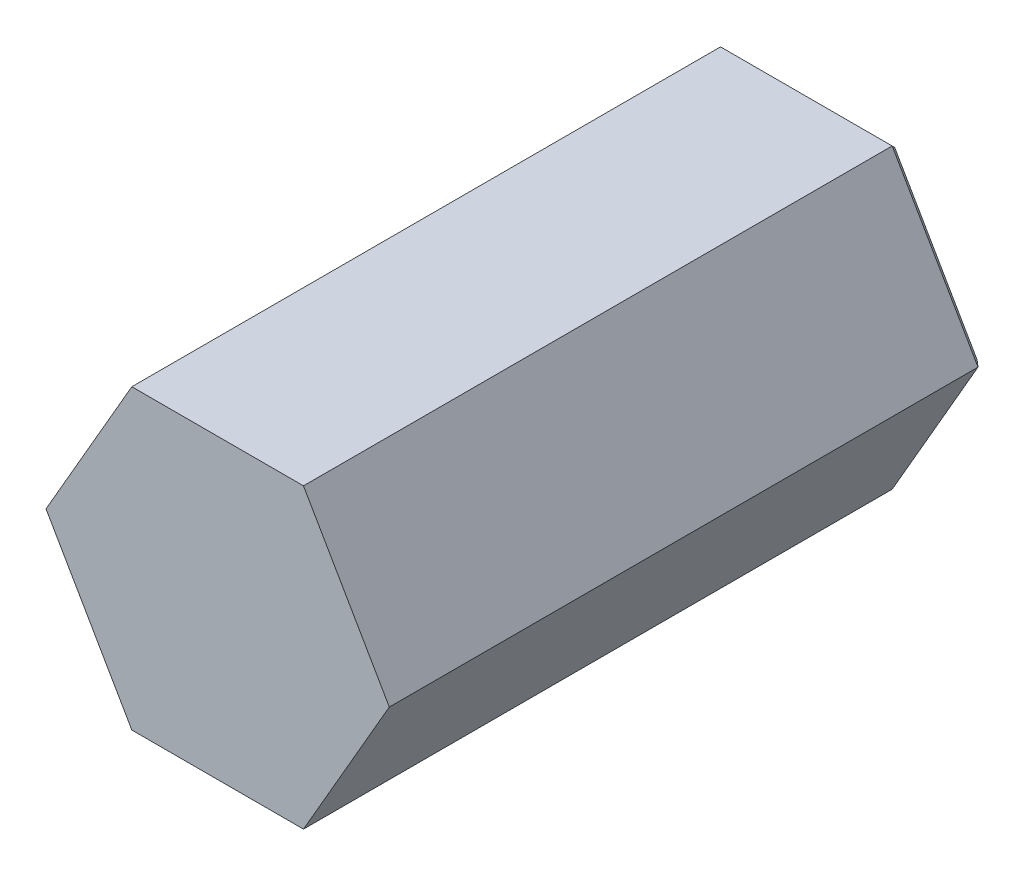
ISO-10303-21;
HEADER;
FILE_DESCRIPTION(('STEP AP214'),'2;1');
FILE_NAME('part.step','',(''),(''),'','','');
FILE_SCHEMA(('AUTOMOTIVE_DESIGN { 1 0 10303 214 1 1 1 1 }'));
ENDSEC;
DATA;
#1=APPLICATION_CONTEXT('core data for automotive mechanical design processes');
#2=APPLICATION_PROTOCOL_DEFINITION('international standard','automotive_design',2000,#1);
#3=PRODUCT_CONTEXT('',#1,'mechanical');
#4=PRODUCT('Part','Part','',(#3));
#5=PRODUCT_RELATED_PRODUCT_CATEGORY('part','',(#4));
#6=PRODUCT_DEFINITION_FORMATION('','',#4);
#7=PRODUCT_DEFINITION_CONTEXT('part definition',#1,'design');
#8=PRODUCT_DEFINITION('design','',#6,#7);
#9=PRODUCT_DEFINITION_SHAPE('','',#8);
#10=(LENGTH_UNIT() NAMED_UNIT(*) SI_UNIT(.MILLI.,.METRE.));
#11=(NAMED_UNIT(*) PLANE_ANGLE_UNIT() SI_UNIT($,.RADIAN.));
#12=(NAMED_UNIT(*) SI_UNIT($,.STERADIAN.) SOLID_ANGLE_UNIT());
#13=UNCERTAINTY_MEASURE_WITH_UNIT(LENGTH_MEASURE(1.E-05),#10,'distance_accuracy_value','');
#14=(GEOMETRIC_REPRESENTATION_CONTEXT(3) GLOBAL_UNCERTAINTY_ASSIGNED_CONTEXT((#13)) GLOBAL_UNIT_ASSIGNED_CONTEXT((#10,
#11,#12)) REPRESENTATION_CONTEXT('',''));
#15=CARTESIAN_POINT('',(0.,0.,0.));
#16=DIRECTION('',(0.,0.,1.));
#17=DIRECTION('',(1.,0.,0.));
#18=AXIS2_PLACEMENT_3D('',#15,#16,#17);
#19=CARTESIAN_POINT('',(3.66617420935412,-6.35,127.));
#20=DIRECTION('',(-0.866025403784439,0.5,0.));
#21=DIRECTION('',(0.,0.,1.));
#22=AXIS2_PLACEMENT_3D('',#19,#20,#21);
#23=PLANE('',#22);
#24=DIRECTION('',(0.5,0.866025403784439,0.));
#25=VECTOR('',#24,1.);
#26=CARTESIAN_POINT('',(3.66617420935412,-6.35,25.4));
#27=LINE('',#26,#25);
#28=CARTESIAN_POINT('',(3.66617420935413,-6.35,25.4));
#29=VERTEX_POINT('',#28);
#30=CARTESIAN_POINT('',(7.33234841870825,0.,25.4));
#31=VERTEX_POINT('',#30);
#32=EDGE_CURVE('E97',#29,#31,#27,.T.);
#33=ORIENTED_EDGE('',*,*,#32,.F.);
#34=DIRECTION('',(0.,0.,-1.));
#35=VECTOR('',#34,1.);
#36=CARTESIAN_POINT('',(3.66617420935412,-6.35,127.));
#37=LINE('',#36,#35);
#38=CARTESIAN_POINT('',(3.66617420935412,-6.35,0.253999999999977));
#39=VERTEX_POINT('',#38);
#40=EDGE_CURVE('E52',#29,#39,#37,.T.);
#41=ORIENTED_EDGE('',*,*,#40,.T.);
#42=DIRECTION('',(0.5,0.866025403784439,0.));
#43=VECTOR('',#42,1.);
#44=CARTESIAN_POINT('',(3.66617420935412,-6.35,0.253999999999977));
#45=LINE('',#44,#43);
#46=CARTESIAN_POINT('',(7.33234841870825,0.,0.253999999999977));
#47=VERTEX_POINT('',#46);
#48=EDGE_CURVE('E156',#39,#47,#45,.T.);
#49=ORIENTED_EDGE('',*,*,#48,.T.);
#50=DIRECTION('',(0.,0.,-1.));
#51=VECTOR('',#50,1.);
#52=CARTESIAN_POINT('',(7.33234841870825,0.,127.));
#53=LINE('',#52,#51);
#54=EDGE_CURVE('E181',#31,#47,#53,.T.);
#55=ORIENTED_EDGE('',*,*,#54,.F.);
#56=EDGE_LOOP('',(#33,#41,#49,#55));
#57=FACE_BOUND('',#56,.T.);
#58=ADVANCED_FACE('F44',(#57),#23,.F.);
#59=CARTESIAN_POINT('',(7.33234841870825,0.,127.));
#60=DIRECTION('',(-0.866025403784439,-0.5,0.));
#61=DIRECTION('',(-0.5,0.866025403784439,0.));
#62=AXIS2_PLACEMENT_3D('',#59,#60,#61);
#63=PLANE('',#62);
#64=DIRECTION('',(-0.5,0.866025403784439,0.));
#65=VECTOR('',#64,1.);
#66=CARTESIAN_POINT('',(7.33234841870825,0.,25.4));
#67=LINE('',#66,#65);
#68=CARTESIAN_POINT('',(3.66617420935412,6.35,25.4));
#69=VERTEX_POINT('',#68);
#70=EDGE_CURVE('E365',#31,#69,#67,.T.);
#71=ORIENTED_EDGE('',*,*,#70,.F.);
#72=ORIENTED_EDGE('',*,*,#54,.T.);
#73=DIRECTION('',(-0.5,0.866025403784438,0.));
#74=VECTOR('',#73,1.);
#75=CARTESIAN_POINT('',(7.33234841870825,0.,0.253999999999977));
#76=LINE('',#75,#74);
#77=CARTESIAN_POINT('',(3.66617420935412,6.35,0.253999999999977));
#78=VERTEX_POINT('',#77);
#79=EDGE_CURVE('E183',#47,#78,#76,.T.);
#80=ORIENTED_EDGE('',*,*,#79,.T.);
#81=DIRECTION('',(0.,0.,-1.));
#82=VECTOR('',#81,1.);
#83=CARTESIAN_POINT('',(3.66617420935412,6.35,127.));
#84=LINE('',#83,#82);
#85=EDGE_CURVE('E201',#69,#78,#84,.T.);
#86=ORIENTED_EDGE('',*,*,#85,.F.);
#87=EDGE_LOOP('',(#71,#72,#80,#86));
#88=FACE_BOUND('',#87,.T.);
#89=ADVANCED_FACE('F46',(#88),#63,.F.);
#90=CARTESIAN_POINT('',(3.66617420935412,6.35,127.));
#91=DIRECTION('',(0.,-1.,0.));
#92=DIRECTION('',(0.,0.,-1.));
#93=AXIS2_PLACEMENT_3D('',#90,#91,#92);
#94=PLANE('',#93);
#95=DIRECTION('',(-1.,0.,0.));
#96=VECTOR('',#95,1.);
#97=CARTESIAN_POINT('',(3.66617420935412,6.35,25.4));
#98=LINE('',#97,#96);
#99=CARTESIAN_POINT('',(-3.66617420935412,6.35,25.4));
#100=VERTEX_POINT('',#99);
#101=EDGE_CURVE('E390',#69,#100,#98,.T.);
#102=ORIENTED_EDGE('',*,*,#101,.F.);
#103=ORIENTED_EDGE('',*,*,#85,.T.);
#104=DIRECTION('',(-1.,0.,0.));
#105=VECTOR('',#104,1.);
#106=CARTESIAN_POINT('',(3.66617420935412,6.35,0.253999999999977));
#107=LINE('',#106,#105);
#108=CARTESIAN_POINT('',(-3.66617420935412,6.35,0.253999999999977));
#109=VERTEX_POINT('',#108);
#110=EDGE_CURVE('E207',#78,#109,#107,.T.);
#111=ORIENTED_EDGE('',*,*,#110,.T.);
#112=DIRECTION('',(0.,0.,-1.));
#113=VECTOR('',#112,1.);
#114=CARTESIAN_POINT('',(-3.66617420935412,6.35,127.));
#115=LINE('',#114,#113);
#116=EDGE_CURVE('E187',#100,#109,#115,.T.);
#117=ORIENTED_EDGE('',*,*,#116,.F.);
#118=EDGE_LOOP('',(#102,#103,#111,#117));
#119=FACE_BOUND('',#118,.T.);
#120=ADVANCED_FACE('F311',(#119),#94,.F.);
#121=CARTESIAN_POINT('',(-3.66617420935412,6.35,127.));
#122=DIRECTION('',(0.866025403784439,-0.5,0.));
#123=DIRECTION('',(0.,0.,-1.));
#124=AXIS2_PLACEMENT_3D('',#121,#122,#123);
#125=PLANE('',#124);
#126=DIRECTION('',(-0.5,-0.866025403784439,0.));
#127=VECTOR('',#126,1.);
#128=CARTESIAN_POINT('',(-3.66617420935412,6.35,25.4));
#129=LINE('',#128,#127);
#130=CARTESIAN_POINT('',(-7.33234841870824,0.,25.4));
#131=VERTEX_POINT('',#130);
#132=EDGE_CURVE('E393',#100,#131,#129,.T.);
#133=ORIENTED_EDGE('',*,*,#132,.F.);
#134=ORIENTED_EDGE('',*,*,#116,.T.);
#135=DIRECTION('',(-0.5,-0.866025403784439,0.));
#136=VECTOR('',#135,1.);
#137=CARTESIAN_POINT('',(-3.66617420935412,6.35,0.253999999999977));
#138=LINE('',#137,#136);
#139=CARTESIAN_POINT('',(-7.33234841870824,0.,0.253999999999977));
#140=VERTEX_POINT('',#139);
#141=EDGE_CURVE('E184',#109,#140,#138,.T.);
#142=ORIENTED_EDGE('',*,*,#141,.T.);
#143=DIRECTION('',(0.,0.,-1.));
#144=VECTOR('',#143,1.);
#145=CARTESIAN_POINT('',(-7.33234841870824,0.,127.));
#146=LINE('',#145,#144);
#147=EDGE_CURVE('E188',#131,#140,#146,.T.);
#148=ORIENTED_EDGE('',*,*,#147,.F.);
#149=EDGE_LOOP('',(#133,#134,#142,#148));
#150=FACE_BOUND('',#149,.T.);
#151=ADVANCED_FACE('F303',(#150),#125,.F.);
#152=CARTESIAN_POINT('',(-7.33234841870824,0.,127.));
#153=DIRECTION('',(0.866025403784439,0.5,0.));
#154=DIRECTION('',(0.,0.,-1.));
#155=AXIS2_PLACEMENT_3D('',#152,#153,#154);
#156=PLANE('',#155);
#157=DIRECTION('',(0.5,-0.866025403784439,0.));
#158=VECTOR('',#157,1.);
#159=CARTESIAN_POINT('',(-7.33234841870824,0.,25.4));
#160=LINE('',#159,#158);
#161=CARTESIAN_POINT('',(-3.66617420935412,-6.35,25.4));
#162=VERTEX_POINT('',#161);
#163=EDGE_CURVE('E58',#131,#162,#160,.T.);
#164=ORIENTED_EDGE('',*,*,#163,.F.);
#165=ORIENTED_EDGE('',*,*,#147,.T.);
#166=DIRECTION('',(0.5,-0.866025403784439,0.));
#167=VECTOR('',#166,1.);
#168=CARTESIAN_POINT('',(-7.33234841870824,0.,0.253999999999977));
#169=LINE('',#168,#167);
#170=CARTESIAN_POINT('',(-3.66617420935412,-6.35,0.253999999999977));
#171=VERTEX_POINT('',#170);
#172=EDGE_CURVE('E193',#140,#171,#169,.T.);
#173=ORIENTED_EDGE('',*,*,#172,.T.);
#174=DIRECTION('',(0.,0.,-1.));
#175=VECTOR('',#174,1.);
#176=CARTESIAN_POINT('',(-3.66617420935412,-6.35,127.));
#177=LINE('',#176,#175);
#178=EDGE_CURVE('E177',#162,#171,#177,.T.);
#179=ORIENTED_EDGE('',*,*,#178,.F.);
#180=EDGE_LOOP('',(#164,#165,#173,#179));
#181=FACE_BOUND('',#180,.T.);
#182=ADVANCED_FACE('F293',(#181),#156,.F.);
#183=CARTESIAN_POINT('',(-3.66617420935412,-6.35,127.));
#184=DIRECTION('',(0.,1.,0.));
#185=DIRECTION('',(1.,0.,0.));
#186=AXIS2_PLACEMENT_3D('',#183,#184,#185);
#187=PLANE('',#186);
#188=DIRECTION('',(1.,0.,0.));
#189=VECTOR('',#188,1.);
#190=CARTESIAN_POINT('',(-3.66617420935412,-6.35,25.4));
#191=LINE('',#190,#189);
#192=EDGE_CURVE('E11',#162,#29,#191,.T.);
#193=ORIENTED_EDGE('',*,*,#192,.F.);
#194=ORIENTED_EDGE('',*,*,#178,.T.);
#195=DIRECTION('',(1.,0.,0.));
#196=VECTOR('',#195,1.);
#197=CARTESIAN_POINT('',(-3.66617420935412,-6.35,0.253999999999977));
#198=LINE('',#197,#196);
#199=EDGE_CURVE('E174',#171,#39,#198,.T.);
#200=ORIENTED_EDGE('',*,*,#199,.T.);
#201=ORIENTED_EDGE('',*,*,#40,.F.);
#202=EDGE_LOOP('',(#193,#194,#200,#201));
#203=FACE_BOUND('',#202,.T.);
#204=ADVANCED_FACE('F229',(#203),#187,.F.);
#205=CARTESIAN_POINT('',(7.33234841870825,0.,0.));
#206=DIRECTION('',(0.,0.,1.));
#207=DIRECTION('',(1.,0.,0.));
#208=AXIS2_PLACEMENT_3D('',#205,#206,#207);
#209=PLANE('',#208);
#210=DIRECTION('',(1.,0.,0.));
#211=VECTOR('',#210,1.);
#212=CARTESIAN_POINT('',(7.33234841870825,6.096,0.));
#213=LINE('',#212,#211);
#214=CARTESIAN_POINT('',(-3.51952724097996,6.096,0.));
#215=VERTEX_POINT('',#214);
#216=CARTESIAN_POINT('',(3.51952724097996,6.096,0.));
#217=VERTEX_POINT('',#216);
#218=EDGE_CURVE('E178',#215,#217,#213,.T.);
#219=ORIENTED_EDGE('',*,*,#218,.T.);
#220=DIRECTION('',(0.5,-0.866025403784438,0.));
#221=VECTOR('',#220,1.);
#222=CARTESIAN_POINT('',(7.11237796614701,-0.126999999999992,0.));
#223=LINE('',#222,#221);
#224=CARTESIAN_POINT('',(7.03905448195993,0.,0.));
#225=VERTEX_POINT('',#224);
#226=EDGE_CURVE('E150',#217,#225,#223,.T.);
#227=ORIENTED_EDGE('',*,*,#226,.T.);
#228=DIRECTION('',(-0.5,-0.866025403784439,0.));
#229=VECTOR('',#228,1.);
#230=CARTESIAN_POINT('',(7.11237796614701,0.126999999999997,0.));
#231=LINE('',#230,#229);
#232=CARTESIAN_POINT('',(3.51952724097996,-6.096,0.));
#233=VERTEX_POINT('',#232);
#234=EDGE_CURVE('E132',#225,#233,#231,.T.);
#235=ORIENTED_EDGE('',*,*,#234,.T.);
#236=DIRECTION('',(-1.,0.,0.));
#237=VECTOR('',#236,1.);
#238=CARTESIAN_POINT('',(7.33234841870825,-6.096,0.));
#239=LINE('',#238,#237);
#240=CARTESIAN_POINT('',(-3.51952724097996,-6.096,0.));
#241=VERTEX_POINT('',#240);
#242=EDGE_CURVE('E140',#233,#241,#239,.T.);
#243=ORIENTED_EDGE('',*,*,#242,.T.);
#244=DIRECTION('',(-0.5,0.866025403784439,0.));
#245=VECTOR('',#244,1.);
#246=CARTESIAN_POINT('',(-3.44620375679288,-6.223,0.));
#247=LINE('',#246,#245);
#248=CARTESIAN_POINT('',(-7.03905448195993,0.,0.));
#249=VERTEX_POINT('',#248);
#250=EDGE_CURVE('E147',#241,#249,#247,.T.);
#251=ORIENTED_EDGE('',*,*,#250,.T.);
#252=DIRECTION('',(0.5,0.866025403784439,0.));
#253=VECTOR('',#252,1.);
#254=CARTESIAN_POINT('',(-3.44620375679288,6.223,0.));
#255=LINE('',#254,#253);
#256=EDGE_CURVE('E88',#249,#215,#255,.T.);
#257=ORIENTED_EDGE('',*,*,#256,.T.);
#258=EDGE_LOOP('',(#219,#227,#235,#243,#251,#257));
#259=FACE_BOUND('',#258,.T.);
#260=ADVANCED_FACE('F149',(#259),#209,.F.);
#261=CARTESIAN_POINT('',(-7.33234841870824,0.,0.253999999999977));
#262=DIRECTION('',(0.612372435695778,0.353553390593265,0.707106781186566));
#263=DIRECTION('',(0.5,-0.866025403784439,0.));
#264=AXIS2_PLACEMENT_3D('',#261,#262,#263);
#265=PLANE('',#264);
#266=DIRECTION('',(-0.755928946018472,0.,0.654653670707957));
#267=VECTOR('',#266,1.);
#268=CARTESIAN_POINT('',(-7.33234841870824,0.,0.253999999999977));
#269=LINE('',#268,#267);
#270=EDGE_CURVE('E158',#249,#140,#269,.T.);
#271=ORIENTED_EDGE('',*,*,#270,.F.);
#272=ORIENTED_EDGE('',*,*,#250,.F.);
#273=DIRECTION('',(0.377964473009234,0.654653670707994,-0.654653670707957));
#274=VECTOR('',#273,1.);
#275=CARTESIAN_POINT('',(-3.66617420935412,-6.35,0.253999999999977));
#276=LINE('',#275,#274);
#277=EDGE_CURVE('E145',#171,#241,#276,.T.);
#278=ORIENTED_EDGE('',*,*,#277,.F.);
#279=ORIENTED_EDGE('',*,*,#172,.F.);
#280=EDGE_LOOP('',(#271,#272,#278,#279));
#281=FACE_BOUND('',#280,.T.);
#282=ADVANCED_FACE('F228',(#281),#265,.F.);
#283=CARTESIAN_POINT('',(-3.66617420935412,-6.35,0.253999999999977));
#284=DIRECTION('',(0.,0.707106781186528,0.707106781186567));
#285=DIRECTION('',(1.,0.,0.));
#286=AXIS2_PLACEMENT_3D('',#283,#284,#285);
#287=PLANE('',#286);
#288=ORIENTED_EDGE('',*,*,#277,.T.);
#289=ORIENTED_EDGE('',*,*,#242,.F.);
#290=DIRECTION('',(-0.377964473009236,0.654653670707993,-0.654653670707956));
#291=VECTOR('',#290,1.);
#292=CARTESIAN_POINT('',(3.66617420935412,-6.35,0.253999999999977));
#293=LINE('',#292,#291);
#294=EDGE_CURVE('E143',#39,#233,#293,.T.);
#295=ORIENTED_EDGE('',*,*,#294,.F.);
#296=ORIENTED_EDGE('',*,*,#199,.F.);
#297=EDGE_LOOP('',(#288,#289,#295,#296));
#298=FACE_BOUND('',#297,.T.);
#299=ADVANCED_FACE('F141',(#298),#287,.F.);
#300=CARTESIAN_POINT('',(-3.66617420935412,6.35,0.253999999999977));
#301=DIRECTION('',(0.612372435695778,-0.353553390593264,0.707106781186567));
#302=DIRECTION('',(-0.5,-0.866025403784439,0.));
#303=AXIS2_PLACEMENT_3D('',#300,#301,#302);
#304=PLANE('',#303);
#305=ORIENTED_EDGE('',*,*,#270,.T.);
#306=ORIENTED_EDGE('',*,*,#141,.F.);
#307=DIRECTION('',(-0.377964473009238,0.654653670707991,0.654653670707957));
#308=VECTOR('',#307,1.);
#309=CARTESIAN_POINT('',(-3.66617420935412,6.35,0.253999999999977));
#310=LINE('',#309,#308);
#311=EDGE_CURVE('E159',#215,#109,#310,.T.);
#312=ORIENTED_EDGE('',*,*,#311,.F.);
#313=ORIENTED_EDGE('',*,*,#256,.F.);
#314=EDGE_LOOP('',(#305,#306,#312,#313));
#315=FACE_BOUND('',#314,.T.);
#316=ADVANCED_FACE('F251',(#315),#304,.F.);
#317=CARTESIAN_POINT('',(3.66617420935412,-6.35,0.253999999999977));
#318=DIRECTION('',(-0.612372435695778,0.353553390593264,0.707106781186567));
#319=DIRECTION('',(0.5,0.866025403784439,0.));
#320=AXIS2_PLACEMENT_3D('',#317,#318,#319);
#321=PLANE('',#320);
#322=ORIENTED_EDGE('',*,*,#294,.T.);
#323=ORIENTED_EDGE('',*,*,#234,.F.);
#324=DIRECTION('',(-0.755928946018472,0.,-0.654653670707957));
#325=VECTOR('',#324,1.);
#326=CARTESIAN_POINT('',(5.23739172764866,0.,-1.56028571428572));
#327=LINE('',#326,#325);
#328=EDGE_CURVE('E168',#47,#225,#327,.T.);
#329=ORIENTED_EDGE('',*,*,#328,.F.);
#330=ORIENTED_EDGE('',*,*,#48,.F.);
#331=EDGE_LOOP('',(#322,#323,#329,#330));
#332=FACE_BOUND('',#331,.T.);
#333=ADVANCED_FACE('F155',(#332),#321,.F.);
#334=CARTESIAN_POINT('',(3.66617420935412,6.35,0.253999999999977));
#335=DIRECTION('',(0.,-0.70710678118653,0.707106781186566));
#336=DIRECTION('',(-1.,0.,0.));
#337=AXIS2_PLACEMENT_3D('',#334,#335,#336);
#338=PLANE('',#337);
#339=ORIENTED_EDGE('',*,*,#311,.T.);
#340=ORIENTED_EDGE('',*,*,#110,.F.);
#341=DIRECTION('',(0.377964473009236,0.654653670707991,0.654653670707958));
#342=VECTOR('',#341,1.);
#343=CARTESIAN_POINT('',(3.66617420935412,6.35,0.253999999999977));
#344=LINE('',#343,#342);
#345=EDGE_CURVE('E173',#217,#78,#344,.T.);
#346=ORIENTED_EDGE('',*,*,#345,.F.);
#347=ORIENTED_EDGE('',*,*,#218,.F.);
#348=EDGE_LOOP('',(#339,#340,#346,#347));
#349=FACE_BOUND('',#348,.T.);
#350=ADVANCED_FACE('F212',(#349),#338,.F.);
#351=CARTESIAN_POINT('',(7.33234841870825,0.,0.253999999999977));
#352=DIRECTION('',(-0.612372435695778,-0.353553390593265,0.707106781186566));
#353=DIRECTION('',(-0.5,0.866025403784439,0.));
#354=AXIS2_PLACEMENT_3D('',#351,#352,#353);
#355=PLANE('',#354);
#356=ORIENTED_EDGE('',*,*,#328,.T.);
#357=ORIENTED_EDGE('',*,*,#226,.F.);
#358=ORIENTED_EDGE('',*,*,#345,.T.);
#359=ORIENTED_EDGE('',*,*,#79,.F.);
#360=EDGE_LOOP('',(#356,#357,#358,#359));
#361=FACE_BOUND('',#360,.T.);
#362=ADVANCED_FACE('F217',(#361),#355,.F.);
#363=CARTESIAN_POINT('',(0.,0.,25.4));
#364=DIRECTION('',(0.,0.,1.));
#365=DIRECTION('',(1.,0.,0.));
#366=AXIS2_PLACEMENT_3D('',#363,#364,#365);
#367=PLANE('',#366);
#368=ORIENTED_EDGE('',*,*,#32,.T.);
#369=ORIENTED_EDGE('',*,*,#70,.T.);
#370=ORIENTED_EDGE('',*,*,#101,.T.);
#371=ORIENTED_EDGE('',*,*,#132,.T.);
#372=ORIENTED_EDGE('',*,*,#163,.T.);
#373=ORIENTED_EDGE('',*,*,#192,.T.);
#374=EDGE_LOOP('',(#368,#369,#370,#371,#372,#373));
#375=FACE_BOUND('',#374,.T.);
#376=ADVANCED_FACE('F245',(#375),#367,.T.);
#377=CLOSED_SHELL('',(#58,#89,#120,#151,#182,#204,#260,#282,#299,#316,#333,#350,#362,#376));
#378=MANIFOLD_SOLID_BREP('B2',#377);
#379=ADVANCED_BREP_SHAPE_REPRESENTATION('',(#18,#378),#14);
#380=SHAPE_DEFINITION_REPRESENTATION(#9,#379);
ENDSEC;
END-ISO-10303-21;
